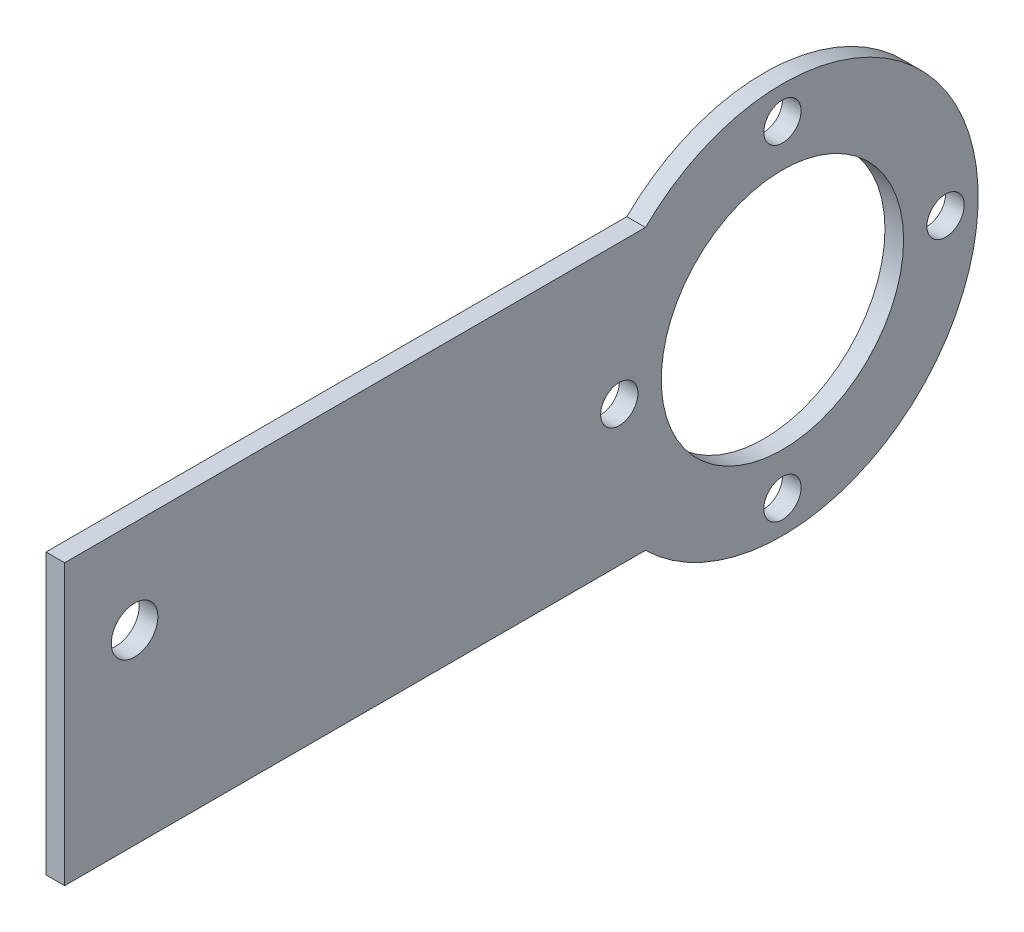
ISO-10303-21;
HEADER;
FILE_DESCRIPTION(('STEP AP214'),'2;1');
FILE_NAME('part.step','',(''),(''),'','','');
FILE_SCHEMA(('AUTOMOTIVE_DESIGN { 1 0 10303 214 1 1 1 1 }'));
ENDSEC;
DATA;
#1=APPLICATION_CONTEXT('core data for automotive mechanical design processes');
#2=APPLICATION_PROTOCOL_DEFINITION('international standard','automotive_design',2000,#1);
#3=PRODUCT_CONTEXT('',#1,'mechanical');
#4=PRODUCT('Part','Part','',(#3));
#5=PRODUCT_RELATED_PRODUCT_CATEGORY('part','',(#4));
#6=PRODUCT_DEFINITION_FORMATION('','',#4);
#7=PRODUCT_DEFINITION_CONTEXT('part definition',#1,'design');
#8=PRODUCT_DEFINITION('design','',#6,#7);
#9=PRODUCT_DEFINITION_SHAPE('','',#8);
#10=(LENGTH_UNIT() NAMED_UNIT(*) SI_UNIT(.MILLI.,.METRE.));
#11=(NAMED_UNIT(*) PLANE_ANGLE_UNIT() SI_UNIT($,.RADIAN.));
#12=(NAMED_UNIT(*) SI_UNIT($,.STERADIAN.) SOLID_ANGLE_UNIT());
#13=UNCERTAINTY_MEASURE_WITH_UNIT(LENGTH_MEASURE(1.E-05),#10,'distance_accuracy_value','');
#14=(GEOMETRIC_REPRESENTATION_CONTEXT(3) GLOBAL_UNCERTAINTY_ASSIGNED_CONTEXT((#13)) GLOBAL_UNIT_ASSIGNED_CONTEXT((#10,
#11,#12)) REPRESENTATION_CONTEXT('',''));
#15=CARTESIAN_POINT('',(0.,0.,0.));
#16=DIRECTION('',(0.,0.,1.));
#17=DIRECTION('',(1.,0.,0.));
#18=AXIS2_PLACEMENT_3D('',#15,#16,#17);
#19=CARTESIAN_POINT('',(2.,55.4121451455559,105.367573178207));
#20=DIRECTION('',(0.,0.,-1.));
#21=DIRECTION('',(-1.,0.,0.));
#22=AXIS2_PLACEMENT_3D('',#19,#20,#21);
#23=PLANE('',#22);
#24=DIRECTION('',(1.,0.,0.));
#25=VECTOR('',#24,1.);
#26=CARTESIAN_POINT('',(-8.,49.4121451455559,105.367573178207));
#27=LINE('',#26,#25);
#28=CARTESIAN_POINT('',(0.,49.4121451455559,105.367573178207));
#29=VERTEX_POINT('',#28);
#30=CARTESIAN_POINT('',(2.,49.4121451455559,105.367573178207));
#31=VERTEX_POINT('',#30);
#32=EDGE_CURVE('E93',#29,#31,#27,.T.);
#33=ORIENTED_EDGE('',*,*,#32,.F.);
#34=DIRECTION('',(0.,-1.,0.));
#35=VECTOR('',#34,1.);
#36=CARTESIAN_POINT('',(0.,55.4121451455559,105.367573178207));
#37=LINE('',#36,#35);
#38=CARTESIAN_POINT('',(0.,19.4121451455559,105.367573178207));
#39=VERTEX_POINT('',#38);
#40=EDGE_CURVE('E74',#29,#39,#37,.T.);
#41=ORIENTED_EDGE('',*,*,#40,.T.);
#42=DIRECTION('',(1.,0.,0.));
#43=VECTOR('',#42,1.);
#44=CARTESIAN_POINT('',(-1.,19.4121451455559,105.367573178207));
#45=LINE('',#44,#43);
#46=CARTESIAN_POINT('',(2.,19.4121451455559,105.367573178207));
#47=VERTEX_POINT('',#46);
#48=EDGE_CURVE('E109',#39,#47,#45,.T.);
#49=ORIENTED_EDGE('',*,*,#48,.T.);
#50=DIRECTION('',(0.,-1.,0.));
#51=VECTOR('',#50,1.);
#52=CARTESIAN_POINT('',(2.,55.4121451455559,105.367573178207));
#53=LINE('',#52,#51);
#54=EDGE_CURVE('E104',#31,#47,#53,.T.);
#55=ORIENTED_EDGE('',*,*,#54,.F.);
#56=EDGE_LOOP('',(#33,#41,#49,#55));
#57=FACE_BOUND('',#56,.T.);
#58=ADVANCED_FACE('F51',(#57),#23,.F.);
#59=CARTESIAN_POINT('',(2.,34.4121451455559,28.3675731782074));
#60=DIRECTION('',(1.,0.,0.));
#61=DIRECTION('',(0.,0.,-1.));
#62=AXIS2_PLACEMENT_3D('',#59,#60,#61);
#63=PLANE('',#62);
#64=CARTESIAN_POINT('',(2.,39.4121451455559,97.8675731782074));
#65=DIRECTION('',(1.,0.,0.));
#66=DIRECTION('',(0.,0.,-1.));
#67=AXIS2_PLACEMENT_3D('',#64,#65,#66);
#68=CIRCLE('',#67,2.5);
#69=CARTESIAN_POINT('',(2.,39.4121451455559,95.3675731782074));
#70=VERTEX_POINT('',#69);
#71=EDGE_CURVE('E198',#70,#70,#68,.T.);
#72=ORIENTED_EDGE('',*,*,#71,.F.);
#73=EDGE_LOOP('',(#72));
#74=FACE_BOUND('',#73,.T.);
#75=CARTESIAN_POINT('',(2.,34.4121451455559,28.3675731782074));
#76=DIRECTION('',(1.,0.,0.));
#77=DIRECTION('',(0.,0.,-1.));
#78=AXIS2_PLACEMENT_3D('',#75,#76,#77);
#79=CIRCLE('',#78,13.);
#80=CARTESIAN_POINT('',(2.,34.4121451455559,15.3675731782074));
#81=VERTEX_POINT('',#80);
#82=EDGE_CURVE('E180',#81,#81,#79,.T.);
#83=ORIENTED_EDGE('',*,*,#82,.F.);
#84=EDGE_LOOP('',(#83));
#85=FACE_BOUND('',#84,.T.);
#86=CARTESIAN_POINT('',(2.,34.4121451455559,45.8675731782074));
#87=DIRECTION('',(1.,0.,0.));
#88=DIRECTION('',(0.,0.,-1.));
#89=AXIS2_PLACEMENT_3D('',#86,#87,#88);
#90=CIRCLE('',#89,2.);
#91=CARTESIAN_POINT('',(2.,34.4121451455559,43.8675731782074));
#92=VERTEX_POINT('',#91);
#93=EDGE_CURVE('E185',#92,#92,#90,.T.);
#94=ORIENTED_EDGE('',*,*,#93,.F.);
#95=EDGE_LOOP('',(#94));
#96=FACE_BOUND('',#95,.T.);
#97=CARTESIAN_POINT('',(2.,51.9121451455559,28.3675731782075));
#98=DIRECTION('',(1.,0.,0.));
#99=DIRECTION('',(0.,0.,-1.));
#100=AXIS2_PLACEMENT_3D('',#97,#98,#99);
#101=CIRCLE('',#100,2.00000000000001);
#102=CARTESIAN_POINT('',(2.,51.9121451455559,26.3675731782075));
#103=VERTEX_POINT('',#102);
#104=EDGE_CURVE('E186',#103,#103,#101,.T.);
#105=ORIENTED_EDGE('',*,*,#104,.F.);
#106=EDGE_LOOP('',(#105));
#107=FACE_BOUND('',#106,.T.);
#108=CARTESIAN_POINT('',(2.,34.4121451455559,10.8675731782074));
#109=DIRECTION('',(1.,0.,0.));
#110=DIRECTION('',(0.,0.,-1.));
#111=AXIS2_PLACEMENT_3D('',#108,#109,#110);
#112=CIRCLE('',#111,2.00000000000001);
#113=CARTESIAN_POINT('',(2.,34.4121451455559,8.86757317820741));
#114=VERTEX_POINT('',#113);
#115=EDGE_CURVE('E189',#114,#114,#112,.T.);
#116=ORIENTED_EDGE('',*,*,#115,.F.);
#117=EDGE_LOOP('',(#116));
#118=FACE_BOUND('',#117,.T.);
#119=CARTESIAN_POINT('',(2.,16.9121451455559,28.3675731782075));
#120=DIRECTION('',(1.,0.,0.));
#121=DIRECTION('',(0.,0.,-1.));
#122=AXIS2_PLACEMENT_3D('',#119,#120,#121);
#123=CIRCLE('',#122,2.00000000000001);
#124=CARTESIAN_POINT('',(2.,16.9121451455559,26.3675731782075));
#125=VERTEX_POINT('',#124);
#126=EDGE_CURVE('E192',#125,#125,#123,.T.);
#127=ORIENTED_EDGE('',*,*,#126,.F.);
#128=EDGE_LOOP('',(#127));
#129=FACE_BOUND('',#128,.T.);
#130=CARTESIAN_POINT('',(2.,34.4121451455559,28.3675731782074));
#131=DIRECTION('',(1.,0.,0.));
#132=DIRECTION('',(0.,0.,-1.));
#133=AXIS2_PLACEMENT_3D('',#130,#131,#132);
#134=CIRCLE('',#133,21.);
#135=CARTESIAN_POINT('',(2.,19.4121451455559,43.0645116349065));
#136=VERTEX_POINT('',#135);
#137=CARTESIAN_POINT('',(2.,49.4121451455559,43.0645116349065));
#138=VERTEX_POINT('',#137);
#139=EDGE_CURVE('E106',#136,#138,#134,.T.);
#140=ORIENTED_EDGE('',*,*,#139,.T.);
#141=DIRECTION('',(0.,0.,1.));
#142=VECTOR('',#141,1.);
#143=CARTESIAN_POINT('',(2.,49.4121451455559,0.));
#144=LINE('',#143,#142);
#145=EDGE_CURVE('E97',#138,#31,#144,.T.);
#146=ORIENTED_EDGE('',*,*,#145,.T.);
#147=ORIENTED_EDGE('',*,*,#54,.T.);
#148=DIRECTION('',(0.,0.,-1.));
#149=VECTOR('',#148,1.);
#150=CARTESIAN_POINT('',(2.,19.4121451455559,0.));
#151=LINE('',#150,#149);
#152=EDGE_CURVE('E182',#47,#136,#151,.T.);
#153=ORIENTED_EDGE('',*,*,#152,.T.);
#154=EDGE_LOOP('',(#140,#146,#147,#153));
#155=FACE_BOUND('',#154,.T.);
#156=ADVANCED_FACE('F102',(#74,#85,#96,#107,#118,#129,#155),#63,.T.);
#157=CARTESIAN_POINT('',(0.,34.4121451455559,28.3675731782074));
#158=DIRECTION('',(1.,0.,0.));
#159=DIRECTION('',(0.,0.,-1.));
#160=AXIS2_PLACEMENT_3D('',#157,#158,#159);
#161=PLANE('',#160);
#162=CARTESIAN_POINT('',(0.,39.4121451455559,97.8675731782074));
#163=DIRECTION('',(1.,0.,0.));
#164=DIRECTION('',(0.,0.,-1.));
#165=AXIS2_PLACEMENT_3D('',#162,#163,#164);
#166=CIRCLE('',#165,2.5);
#167=CARTESIAN_POINT('',(0.,39.4121451455559,95.3675731782074));
#168=VERTEX_POINT('',#167);
#169=EDGE_CURVE('E54',#168,#168,#166,.T.);
#170=ORIENTED_EDGE('',*,*,#169,.T.);
#171=EDGE_LOOP('',(#170));
#172=FACE_BOUND('',#171,.T.);
#173=CARTESIAN_POINT('',(0.,16.9121451455559,28.3675731782075));
#174=DIRECTION('',(1.,0.,0.));
#175=DIRECTION('',(0.,0.,-1.));
#176=AXIS2_PLACEMENT_3D('',#173,#174,#175);
#177=CIRCLE('',#176,2.00000000000001);
#178=CARTESIAN_POINT('',(0.,16.9121451455559,26.3675731782075));
#179=VERTEX_POINT('',#178);
#180=EDGE_CURVE('E117',#179,#179,#177,.T.);
#181=ORIENTED_EDGE('',*,*,#180,.T.);
#182=EDGE_LOOP('',(#181));
#183=FACE_BOUND('',#182,.T.);
#184=CARTESIAN_POINT('',(0.,51.9121451455559,28.3675731782075));
#185=DIRECTION('',(1.,0.,0.));
#186=DIRECTION('',(0.,0.,-1.));
#187=AXIS2_PLACEMENT_3D('',#184,#185,#186);
#188=CIRCLE('',#187,2.00000000000001);
#189=CARTESIAN_POINT('',(0.,51.9121451455559,26.3675731782075));
#190=VERTEX_POINT('',#189);
#191=EDGE_CURVE('E127',#190,#190,#188,.T.);
#192=ORIENTED_EDGE('',*,*,#191,.T.);
#193=EDGE_LOOP('',(#192));
#194=FACE_BOUND('',#193,.T.);
#195=CARTESIAN_POINT('',(0.,34.4121451455559,28.3675731782074));
#196=DIRECTION('',(1.,0.,0.));
#197=DIRECTION('',(0.,0.,-1.));
#198=AXIS2_PLACEMENT_3D('',#195,#196,#197);
#199=CIRCLE('',#198,13.);
#200=CARTESIAN_POINT('',(0.,34.4121451455559,15.3675731782074));
#201=VERTEX_POINT('',#200);
#202=EDGE_CURVE('E121',#201,#201,#199,.T.);
#203=ORIENTED_EDGE('',*,*,#202,.T.);
#204=EDGE_LOOP('',(#203));
#205=FACE_BOUND('',#204,.T.);
#206=CARTESIAN_POINT('',(0.,34.4121451455559,45.8675731782074));
#207=DIRECTION('',(1.,0.,0.));
#208=DIRECTION('',(0.,0.,-1.));
#209=AXIS2_PLACEMENT_3D('',#206,#207,#208);
#210=CIRCLE('',#209,2.);
#211=CARTESIAN_POINT('',(0.,34.4121451455559,43.8675731782074));
#212=VERTEX_POINT('',#211);
#213=EDGE_CURVE('E124',#212,#212,#210,.T.);
#214=ORIENTED_EDGE('',*,*,#213,.T.);
#215=EDGE_LOOP('',(#214));
#216=FACE_BOUND('',#215,.T.);
#217=CARTESIAN_POINT('',(0.,34.4121451455559,10.8675731782074));
#218=DIRECTION('',(1.,0.,0.));
#219=DIRECTION('',(0.,0.,-1.));
#220=AXIS2_PLACEMENT_3D('',#217,#218,#219);
#221=CIRCLE('',#220,2.00000000000001);
#222=CARTESIAN_POINT('',(0.,34.4121451455559,8.86757317820741));
#223=VERTEX_POINT('',#222);
#224=EDGE_CURVE('E130',#223,#223,#221,.T.);
#225=ORIENTED_EDGE('',*,*,#224,.T.);
#226=EDGE_LOOP('',(#225));
#227=FACE_BOUND('',#226,.T.);
#228=DIRECTION('',(0.,0.,1.));
#229=VECTOR('',#228,1.);
#230=CARTESIAN_POINT('',(0.,49.4121451455559,28.3675731782074));
#231=LINE('',#230,#229);
#232=CARTESIAN_POINT('',(0.,49.4121451455559,43.0645116349065));
#233=VERTEX_POINT('',#232);
#234=EDGE_CURVE('E12',#233,#29,#231,.T.);
#235=ORIENTED_EDGE('',*,*,#234,.F.);
#236=CARTESIAN_POINT('',(0.,34.4121451455559,28.3675731782074));
#237=DIRECTION('',(1.,0.,0.));
#238=DIRECTION('',(0.,0.,-1.));
#239=AXIS2_PLACEMENT_3D('',#236,#237,#238);
#240=CIRCLE('',#239,21.);
#241=CARTESIAN_POINT('',(0.,19.4121451455559,43.0645116349065));
#242=VERTEX_POINT('',#241);
#243=EDGE_CURVE('E66',#242,#233,#240,.T.);
#244=ORIENTED_EDGE('',*,*,#243,.F.);
#245=DIRECTION('',(0.,0.,-1.));
#246=VECTOR('',#245,1.);
#247=CARTESIAN_POINT('',(0.,19.4121451455559,28.3675731782074));
#248=LINE('',#247,#246);
#249=EDGE_CURVE('E59',#39,#242,#248,.T.);
#250=ORIENTED_EDGE('',*,*,#249,.F.);
#251=ORIENTED_EDGE('',*,*,#40,.F.);
#252=EDGE_LOOP('',(#235,#244,#250,#251));
#253=FACE_BOUND('',#252,.T.);
#254=ADVANCED_FACE('F136',(#172,#183,#194,#205,#216,#227,#253),#161,.F.);
#255=CARTESIAN_POINT('',(2.,34.4121451455559,28.3675731782074));
#256=DIRECTION('',(-1.,0.,0.));
#257=DIRECTION('',(0.,0.,1.));
#258=AXIS2_PLACEMENT_3D('',#255,#256,#257);
#259=CYLINDRICAL_SURFACE('',#258,21.);
#260=ORIENTED_EDGE('',*,*,#243,.T.);
#261=DIRECTION('',(1.,0.,0.));
#262=VECTOR('',#261,1.);
#263=CARTESIAN_POINT('',(-8.,49.4121451455559,43.0645116349065));
#264=LINE('',#263,#262);
#265=EDGE_CURVE('E99',#233,#138,#264,.T.);
#266=ORIENTED_EDGE('',*,*,#265,.T.);
#267=ORIENTED_EDGE('',*,*,#139,.F.);
#268=DIRECTION('',(1.,0.,0.));
#269=VECTOR('',#268,1.);
#270=CARTESIAN_POINT('',(-1.,19.4121451455559,43.0645116349065));
#271=LINE('',#270,#269);
#272=EDGE_CURVE('E114',#242,#136,#271,.T.);
#273=ORIENTED_EDGE('',*,*,#272,.F.);
#274=EDGE_LOOP('',(#260,#266,#267,#273));
#275=FACE_BOUND('',#274,.T.);
#276=ADVANCED_FACE('F164',(#275),#259,.T.);
#277=CARTESIAN_POINT('',(-1.,19.4121451455559,0.));
#278=DIRECTION('',(0.,-1.,0.));
#279=DIRECTION('',(0.,0.,-1.));
#280=AXIS2_PLACEMENT_3D('',#277,#278,#279);
#281=PLANE('',#280);
#282=ORIENTED_EDGE('',*,*,#249,.T.);
#283=ORIENTED_EDGE('',*,*,#272,.T.);
#284=ORIENTED_EDGE('',*,*,#152,.F.);
#285=ORIENTED_EDGE('',*,*,#48,.F.);
#286=EDGE_LOOP('',(#282,#283,#284,#285));
#287=FACE_BOUND('',#286,.T.);
#288=ADVANCED_FACE('F170',(#287),#281,.T.);
#289=CARTESIAN_POINT('',(-1.,34.4121451455559,28.3675731782074));
#290=DIRECTION('',(1.,0.,0.));
#291=DIRECTION('',(0.,0.,-1.));
#292=AXIS2_PLACEMENT_3D('',#289,#290,#291);
#293=CYLINDRICAL_SURFACE('',#292,13.);
#294=ORIENTED_EDGE('',*,*,#82,.T.);
#295=EDGE_LOOP('',(#294));
#296=FACE_BOUND('',#295,.T.);
#297=ORIENTED_EDGE('',*,*,#202,.F.);
#298=EDGE_LOOP('',(#297));
#299=FACE_BOUND('',#298,.T.);
#300=ADVANCED_FACE('F177',(#296,#299),#293,.F.);
#301=CARTESIAN_POINT('',(-1.,34.4121451455559,45.8675731782074));
#302=DIRECTION('',(1.,0.,0.));
#303=DIRECTION('',(0.,0.,-1.));
#304=AXIS2_PLACEMENT_3D('',#301,#302,#303);
#305=CYLINDRICAL_SURFACE('',#304,2.);
#306=ORIENTED_EDGE('',*,*,#93,.T.);
#307=EDGE_LOOP('',(#306));
#308=FACE_BOUND('',#307,.T.);
#309=ORIENTED_EDGE('',*,*,#213,.F.);
#310=EDGE_LOOP('',(#309));
#311=FACE_BOUND('',#310,.T.);
#312=ADVANCED_FACE('F210',(#308,#311),#305,.F.);
#313=CARTESIAN_POINT('',(-1.,51.9121451455559,28.3675731782075));
#314=DIRECTION('',(1.,0.,0.));
#315=DIRECTION('',(0.,0.,-1.));
#316=AXIS2_PLACEMENT_3D('',#313,#314,#315);
#317=CYLINDRICAL_SURFACE('',#316,2.00000000000001);
#318=ORIENTED_EDGE('',*,*,#104,.T.);
#319=EDGE_LOOP('',(#318));
#320=FACE_BOUND('',#319,.T.);
#321=ORIENTED_EDGE('',*,*,#191,.F.);
#322=EDGE_LOOP('',(#321));
#323=FACE_BOUND('',#322,.T.);
#324=ADVANCED_FACE('F150',(#320,#323),#317,.F.);
#325=CARTESIAN_POINT('',(-1.,34.4121451455559,10.8675731782074));
#326=DIRECTION('',(1.,0.,0.));
#327=DIRECTION('',(0.,0.,-1.));
#328=AXIS2_PLACEMENT_3D('',#325,#326,#327);
#329=CYLINDRICAL_SURFACE('',#328,2.00000000000001);
#330=ORIENTED_EDGE('',*,*,#115,.T.);
#331=EDGE_LOOP('',(#330));
#332=FACE_BOUND('',#331,.T.);
#333=ORIENTED_EDGE('',*,*,#224,.F.);
#334=EDGE_LOOP('',(#333));
#335=FACE_BOUND('',#334,.T.);
#336=ADVANCED_FACE('F141',(#332,#335),#329,.F.);
#337=CARTESIAN_POINT('',(-1.,16.9121451455559,28.3675731782075));
#338=DIRECTION('',(1.,0.,0.));
#339=DIRECTION('',(0.,0.,-1.));
#340=AXIS2_PLACEMENT_3D('',#337,#338,#339);
#341=CYLINDRICAL_SURFACE('',#340,2.00000000000001);
#342=ORIENTED_EDGE('',*,*,#126,.T.);
#343=EDGE_LOOP('',(#342));
#344=FACE_BOUND('',#343,.T.);
#345=ORIENTED_EDGE('',*,*,#180,.F.);
#346=EDGE_LOOP('',(#345));
#347=FACE_BOUND('',#346,.T.);
#348=ADVANCED_FACE('F139',(#344,#347),#341,.F.);
#349=CARTESIAN_POINT('',(-8.,49.4121451455559,0.));
#350=DIRECTION('',(0.,1.,0.));
#351=DIRECTION('',(0.,0.,1.));
#352=AXIS2_PLACEMENT_3D('',#349,#350,#351);
#353=PLANE('',#352);
#354=ORIENTED_EDGE('',*,*,#234,.T.);
#355=ORIENTED_EDGE('',*,*,#32,.T.);
#356=ORIENTED_EDGE('',*,*,#145,.F.);
#357=ORIENTED_EDGE('',*,*,#265,.F.);
#358=EDGE_LOOP('',(#354,#355,#356,#357));
#359=FACE_BOUND('',#358,.T.);
#360=ADVANCED_FACE('F95',(#359),#353,.T.);
#361=CARTESIAN_POINT('',(-8.,39.4121451455559,97.8675731782074));
#362=DIRECTION('',(1.,0.,0.));
#363=DIRECTION('',(0.,0.,-1.));
#364=AXIS2_PLACEMENT_3D('',#361,#362,#363);
#365=CYLINDRICAL_SURFACE('',#364,2.5);
#366=ORIENTED_EDGE('',*,*,#71,.T.);
#367=EDGE_LOOP('',(#366));
#368=FACE_BOUND('',#367,.T.);
#369=ORIENTED_EDGE('',*,*,#169,.F.);
#370=EDGE_LOOP('',(#369));
#371=FACE_BOUND('',#370,.T.);
#372=ADVANCED_FACE('F148',(#368,#371),#365,.F.);
#373=CLOSED_SHELL('',(#58,#156,#254,#276,#288,#300,#312,#324,#336,#348,#360,#372));
#374=MANIFOLD_SOLID_BREP('B2',#373);
#375=ADVANCED_BREP_SHAPE_REPRESENTATION('',(#18,#374),#14);
#376=SHAPE_DEFINITION_REPRESENTATION(#9,#375);
ENDSEC;
END-ISO-10303-21;
